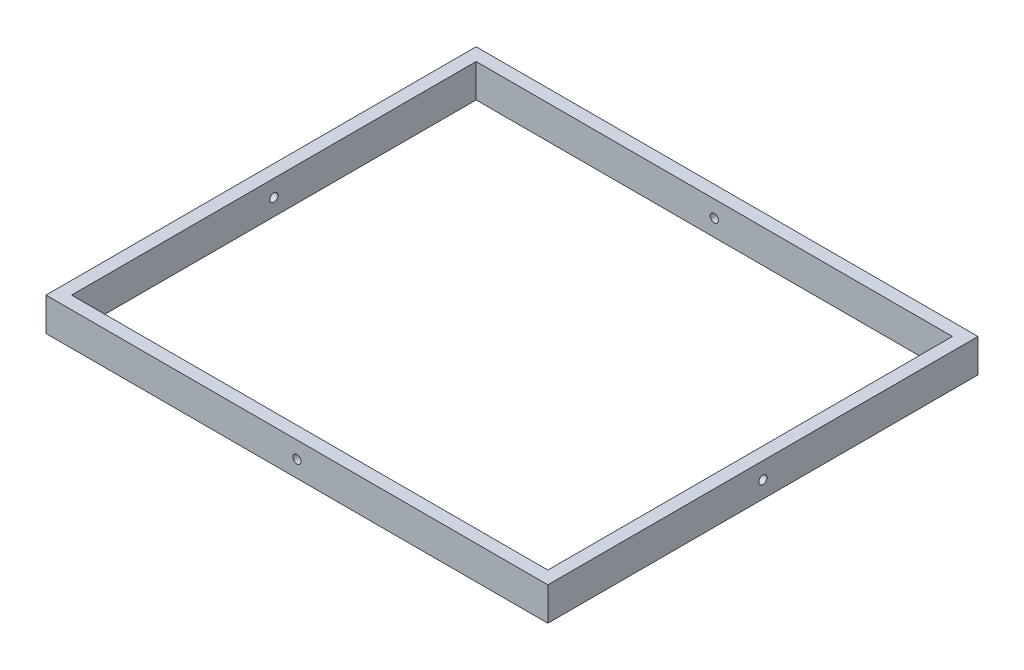
ISO-10303-21;
HEADER;
FILE_DESCRIPTION(('STEP AP214'),'2;1');
FILE_NAME('part.step','',(''),(''),'','','');
FILE_SCHEMA(('AUTOMOTIVE_DESIGN { 1 0 10303 214 1 1 1 1 }'));
ENDSEC;
DATA;
#1=APPLICATION_CONTEXT('core data for automotive mechanical design processes');
#2=APPLICATION_PROTOCOL_DEFINITION('international standard','automotive_design',2000,#1);
#3=PRODUCT_CONTEXT('',#1,'mechanical');
#4=PRODUCT('Part','Part','',(#3));
#5=PRODUCT_RELATED_PRODUCT_CATEGORY('part','',(#4));
#6=PRODUCT_DEFINITION_FORMATION('','',#4);
#7=PRODUCT_DEFINITION_CONTEXT('part definition',#1,'design');
#8=PRODUCT_DEFINITION('design','',#6,#7);
#9=PRODUCT_DEFINITION_SHAPE('','',#8);
#10=(LENGTH_UNIT() NAMED_UNIT(*) SI_UNIT(.MILLI.,.METRE.));
#11=(NAMED_UNIT(*) PLANE_ANGLE_UNIT() SI_UNIT($,.RADIAN.));
#12=(NAMED_UNIT(*) SI_UNIT($,.STERADIAN.) SOLID_ANGLE_UNIT());
#13=UNCERTAINTY_MEASURE_WITH_UNIT(LENGTH_MEASURE(1.E-05),#10,'distance_accuracy_value','');
#14=(GEOMETRIC_REPRESENTATION_CONTEXT(3) GLOBAL_UNCERTAINTY_ASSIGNED_CONTEXT((#13)) GLOBAL_UNIT_ASSIGNED_CONTEXT((#10,
#11,#12)) REPRESENTATION_CONTEXT('',''));
#15=CARTESIAN_POINT('',(0.,0.,0.));
#16=DIRECTION('',(0.,0.,1.));
#17=DIRECTION('',(1.,0.,0.));
#18=AXIS2_PLACEMENT_3D('',#15,#16,#17);
#19=CARTESIAN_POINT('',(0.,20.6375,0.));
#20=DIRECTION('',(0.,1.,0.));
#21=DIRECTION('',(0.,0.,1.));
#22=AXIS2_PLACEMENT_3D('',#19,#20,#21);
#23=PLANE('',#22);
#24=DIRECTION('',(0.,0.,1.));
#25=VECTOR('',#24,1.);
#26=CARTESIAN_POINT('',(-173.88926750961,20.6375,-63.1965982999433));
#27=LINE('',#26,#25);
#28=CARTESIAN_POINT('',(-173.88926750961,20.6375,-63.1965982999433));
#29=VERTEX_POINT('',#28);
#30=CARTESIAN_POINT('',(-173.88926750961,20.6375,203.503401700057));
#31=VERTEX_POINT('',#30);
#32=EDGE_CURVE('E157',#29,#31,#27,.T.);
#33=ORIENTED_EDGE('',*,*,#32,.T.);
#34=DIRECTION('',(1.,0.,0.));
#35=VECTOR('',#34,1.);
#36=CARTESIAN_POINT('',(-173.88926750961,20.6375,203.503401700057));
#37=LINE('',#36,#35);
#38=CARTESIAN_POINT('',(137.26073249039,20.6375,203.503401700057));
#39=VERTEX_POINT('',#38);
#40=EDGE_CURVE('E161',#31,#39,#37,.T.);
#41=ORIENTED_EDGE('',*,*,#40,.T.);
#42=DIRECTION('',(0.,0.,-1.));
#43=VECTOR('',#42,1.);
#44=CARTESIAN_POINT('',(137.26073249039,20.6375,-63.1965982999433));
#45=LINE('',#44,#43);
#46=CARTESIAN_POINT('',(137.26073249039,20.6375,-63.1965982999433));
#47=VERTEX_POINT('',#46);
#48=EDGE_CURVE('E165',#39,#47,#45,.T.);
#49=ORIENTED_EDGE('',*,*,#48,.T.);
#50=DIRECTION('',(-1.,0.,0.));
#51=VECTOR('',#50,1.);
#52=CARTESIAN_POINT('',(-173.88926750961,20.6375,-63.1965982999433));
#53=LINE('',#52,#51);
#54=EDGE_CURVE('E168',#47,#29,#53,.T.);
#55=ORIENTED_EDGE('',*,*,#54,.T.);
#56=EDGE_LOOP('',(#33,#41,#49,#55));
#57=FACE_BOUND('',#56,.T.);
#58=DIRECTION('',(1.,0.,0.));
#59=VECTOR('',#58,1.);
#60=CARTESIAN_POINT('',(-165.95176750961,20.6375,195.565901700057));
#61=LINE('',#60,#59);
#62=CARTESIAN_POINT('',(-165.95176750961,20.6375,195.565901700057));
#63=VERTEX_POINT('',#62);
#64=CARTESIAN_POINT('',(129.32323249039,20.6375,195.565901700057));
#65=VERTEX_POINT('',#64);
#66=EDGE_CURVE('E116',#63,#65,#61,.T.);
#67=ORIENTED_EDGE('',*,*,#66,.F.);
#68=DIRECTION('',(0.,0.,1.));
#69=VECTOR('',#68,1.);
#70=CARTESIAN_POINT('',(-165.95176750961,20.6375,-55.2590982999433));
#71=LINE('',#70,#69);
#72=CARTESIAN_POINT('',(-165.95176750961,20.6375,-55.2590982999433));
#73=VERTEX_POINT('',#72);
#74=EDGE_CURVE('E107',#73,#63,#71,.T.);
#75=ORIENTED_EDGE('',*,*,#74,.F.);
#76=DIRECTION('',(-1.,0.,0.));
#77=VECTOR('',#76,1.);
#78=CARTESIAN_POINT('',(-165.95176750961,20.6375,-55.2590982999433));
#79=LINE('',#78,#77);
#80=CARTESIAN_POINT('',(129.32323249039,20.6375,-55.2590982999433));
#81=VERTEX_POINT('',#80);
#82=EDGE_CURVE('E133',#81,#73,#79,.T.);
#83=ORIENTED_EDGE('',*,*,#82,.F.);
#84=DIRECTION('',(0.,0.,-1.));
#85=VECTOR('',#84,1.);
#86=CARTESIAN_POINT('',(129.32323249039,20.6375,-55.2590982999433));
#87=LINE('',#86,#85);
#88=EDGE_CURVE('E129',#65,#81,#87,.T.);
#89=ORIENTED_EDGE('',*,*,#88,.F.);
#90=EDGE_LOOP('',(#67,#75,#83,#89));
#91=FACE_BOUND('',#90,.T.);
#92=ADVANCED_FACE('F39',(#57,#91),#23,.T.);
#93=CARTESIAN_POINT('',(0.,0.,0.));
#94=DIRECTION('',(0.,1.,0.));
#95=DIRECTION('',(0.,0.,1.));
#96=AXIS2_PLACEMENT_3D('',#93,#94,#95);
#97=PLANE('',#96);
#98=DIRECTION('',(0.,0.,1.));
#99=VECTOR('',#98,1.);
#100=CARTESIAN_POINT('',(-173.88926750961,0.,-63.1965982999433));
#101=LINE('',#100,#99);
#102=CARTESIAN_POINT('',(-173.88926750961,0.,-63.1965982999433));
#103=VERTEX_POINT('',#102);
#104=CARTESIAN_POINT('',(-173.88926750961,0.,203.503401700057));
#105=VERTEX_POINT('',#104);
#106=EDGE_CURVE('E125',#103,#105,#101,.T.);
#107=ORIENTED_EDGE('',*,*,#106,.F.);
#108=DIRECTION('',(-1.,0.,0.));
#109=VECTOR('',#108,1.);
#110=CARTESIAN_POINT('',(-173.88926750961,0.,-63.1965982999433));
#111=LINE('',#110,#109);
#112=CARTESIAN_POINT('',(137.26073249039,0.,-63.1965982999433));
#113=VERTEX_POINT('',#112);
#114=EDGE_CURVE('E162',#113,#103,#111,.T.);
#115=ORIENTED_EDGE('',*,*,#114,.F.);
#116=DIRECTION('',(0.,0.,-1.));
#117=VECTOR('',#116,1.);
#118=CARTESIAN_POINT('',(137.26073249039,0.,-63.1965982999433));
#119=LINE('',#118,#117);
#120=CARTESIAN_POINT('',(137.26073249039,0.,203.503401700057));
#121=VERTEX_POINT('',#120);
#122=EDGE_CURVE('E178',#121,#113,#119,.T.);
#123=ORIENTED_EDGE('',*,*,#122,.F.);
#124=DIRECTION('',(1.,0.,0.));
#125=VECTOR('',#124,1.);
#126=CARTESIAN_POINT('',(-173.88926750961,0.,203.503401700057));
#127=LINE('',#126,#125);
#128=EDGE_CURVE('E175',#105,#121,#127,.T.);
#129=ORIENTED_EDGE('',*,*,#128,.F.);
#130=EDGE_LOOP('',(#107,#115,#123,#129));
#131=FACE_BOUND('',#130,.T.);
#132=DIRECTION('',(0.,0.,1.));
#133=VECTOR('',#132,1.);
#134=CARTESIAN_POINT('',(-165.95176750961,0.,-55.2590982999433));
#135=LINE('',#134,#133);
#136=CARTESIAN_POINT('',(-165.95176750961,0.,-55.2590982999433));
#137=VERTEX_POINT('',#136);
#138=CARTESIAN_POINT('',(-165.95176750961,0.,195.565901700057));
#139=VERTEX_POINT('',#138);
#140=EDGE_CURVE('E65',#137,#139,#135,.T.);
#141=ORIENTED_EDGE('',*,*,#140,.T.);
#142=DIRECTION('',(1.,0.,0.));
#143=VECTOR('',#142,1.);
#144=CARTESIAN_POINT('',(-165.95176750961,0.,195.565901700057));
#145=LINE('',#144,#143);
#146=CARTESIAN_POINT('',(129.32323249039,0.,195.565901700057));
#147=VERTEX_POINT('',#146);
#148=EDGE_CURVE('E123',#139,#147,#145,.T.);
#149=ORIENTED_EDGE('',*,*,#148,.T.);
#150=DIRECTION('',(0.,0.,-1.));
#151=VECTOR('',#150,1.);
#152=CARTESIAN_POINT('',(129.32323249039,0.,-55.2590982999433));
#153=LINE('',#152,#151);
#154=CARTESIAN_POINT('',(129.32323249039,0.,-55.2590982999433));
#155=VERTEX_POINT('',#154);
#156=EDGE_CURVE('E144',#147,#155,#153,.T.);
#157=ORIENTED_EDGE('',*,*,#156,.T.);
#158=DIRECTION('',(-1.,0.,0.));
#159=VECTOR('',#158,1.);
#160=CARTESIAN_POINT('',(-165.95176750961,0.,-55.2590982999433));
#161=LINE('',#160,#159);
#162=EDGE_CURVE('E117',#155,#137,#161,.T.);
#163=ORIENTED_EDGE('',*,*,#162,.T.);
#164=EDGE_LOOP('',(#141,#149,#157,#163));
#165=FACE_BOUND('',#164,.T.);
#166=ADVANCED_FACE('F237',(#131,#165),#97,.F.);
#167=CARTESIAN_POINT('',(-173.88926750961,20.6375,-63.1965982999433));
#168=DIRECTION('',(1.,0.,0.));
#169=DIRECTION('',(0.,0.,-1.));
#170=AXIS2_PLACEMENT_3D('',#167,#168,#169);
#171=PLANE('',#170);
#172=CARTESIAN_POINT('',(-173.88926750961,10.31875,70.1534017000567));
#173=DIRECTION('',(1.,0.,0.));
#174=DIRECTION('',(0.,0.,-1.));
#175=AXIS2_PLACEMENT_3D('',#172,#173,#174);
#176=CIRCLE('',#175,2.54);
#177=CARTESIAN_POINT('',(-173.88926750961,10.31875,67.6134017000568));
#178=VERTEX_POINT('',#177);
#179=EDGE_CURVE('E218',#178,#178,#176,.T.);
#180=ORIENTED_EDGE('',*,*,#179,.T.);
#181=EDGE_LOOP('',(#180));
#182=FACE_BOUND('',#181,.T.);
#183=ORIENTED_EDGE('',*,*,#106,.T.);
#184=DIRECTION('',(0.,-1.,0.));
#185=VECTOR('',#184,1.);
#186=CARTESIAN_POINT('',(-173.88926750961,20.6375,203.503401700057));
#187=LINE('',#186,#185);
#188=EDGE_CURVE('E11',#31,#105,#187,.T.);
#189=ORIENTED_EDGE('',*,*,#188,.F.);
#190=ORIENTED_EDGE('',*,*,#32,.F.);
#191=DIRECTION('',(0.,-1.,0.));
#192=VECTOR('',#191,1.);
#193=CARTESIAN_POINT('',(-173.88926750961,20.6375,-63.1965982999433));
#194=LINE('',#193,#192);
#195=EDGE_CURVE('E171',#29,#103,#194,.T.);
#196=ORIENTED_EDGE('',*,*,#195,.T.);
#197=EDGE_LOOP('',(#183,#189,#190,#196));
#198=FACE_BOUND('',#197,.T.);
#199=ADVANCED_FACE('F41',(#182,#198),#171,.F.);
#200=CARTESIAN_POINT('',(-173.88926750961,20.6375,203.503401700057));
#201=DIRECTION('',(0.,0.,-1.));
#202=DIRECTION('',(-1.,0.,0.));
#203=AXIS2_PLACEMENT_3D('',#200,#201,#202);
#204=PLANE('',#203);
#205=CARTESIAN_POINT('',(-18.3142675096096,10.31875,203.503401700057));
#206=DIRECTION('',(0.,0.,1.));
#207=DIRECTION('',(1.,0.,0.));
#208=AXIS2_PLACEMENT_3D('',#205,#206,#207);
#209=CIRCLE('',#208,2.54);
#210=CARTESIAN_POINT('',(-15.7742675096096,10.31875,203.503401700057));
#211=VERTEX_POINT('',#210);
#212=EDGE_CURVE('E202',#211,#211,#209,.T.);
#213=ORIENTED_EDGE('',*,*,#212,.F.);
#214=EDGE_LOOP('',(#213));
#215=FACE_BOUND('',#214,.T.);
#216=ORIENTED_EDGE('',*,*,#128,.T.);
#217=DIRECTION('',(0.,-1.,0.));
#218=VECTOR('',#217,1.);
#219=CARTESIAN_POINT('',(137.26073249039,20.6375,203.503401700057));
#220=LINE('',#219,#218);
#221=EDGE_CURVE('E49',#39,#121,#220,.T.);
#222=ORIENTED_EDGE('',*,*,#221,.F.);
#223=ORIENTED_EDGE('',*,*,#40,.F.);
#224=ORIENTED_EDGE('',*,*,#188,.T.);
#225=EDGE_LOOP('',(#216,#222,#223,#224));
#226=FACE_BOUND('',#225,.T.);
#227=ADVANCED_FACE('F263',(#215,#226),#204,.F.);
#228=CARTESIAN_POINT('',(137.26073249039,20.6375,-63.1965982999433));
#229=DIRECTION('',(-1.,0.,0.));
#230=DIRECTION('',(0.,0.,1.));
#231=AXIS2_PLACEMENT_3D('',#228,#229,#230);
#232=PLANE('',#231);
#233=CARTESIAN_POINT('',(137.26073249039,10.31875,70.1534017000567));
#234=DIRECTION('',(1.,0.,0.));
#235=DIRECTION('',(0.,0.,-1.));
#236=AXIS2_PLACEMENT_3D('',#233,#234,#235);
#237=CIRCLE('',#236,2.54);
#238=CARTESIAN_POINT('',(137.26073249039,10.31875,67.6134017000567));
#239=VERTEX_POINT('',#238);
#240=EDGE_CURVE('E214',#239,#239,#237,.T.);
#241=ORIENTED_EDGE('',*,*,#240,.F.);
#242=EDGE_LOOP('',(#241));
#243=FACE_BOUND('',#242,.T.);
#244=ORIENTED_EDGE('',*,*,#122,.T.);
#245=DIRECTION('',(0.,-1.,0.));
#246=VECTOR('',#245,1.);
#247=CARTESIAN_POINT('',(137.26073249039,20.6375,-63.1965982999433));
#248=LINE('',#247,#246);
#249=EDGE_CURVE('E186',#47,#113,#248,.T.);
#250=ORIENTED_EDGE('',*,*,#249,.F.);
#251=ORIENTED_EDGE('',*,*,#48,.F.);
#252=ORIENTED_EDGE('',*,*,#221,.T.);
#253=EDGE_LOOP('',(#244,#250,#251,#252));
#254=FACE_BOUND('',#253,.T.);
#255=ADVANCED_FACE('F261',(#243,#254),#232,.F.);
#256=CARTESIAN_POINT('',(-173.88926750961,20.6375,-63.1965982999433));
#257=DIRECTION('',(0.,0.,1.));
#258=DIRECTION('',(1.,0.,0.));
#259=AXIS2_PLACEMENT_3D('',#256,#257,#258);
#260=PLANE('',#259);
#261=CARTESIAN_POINT('',(-18.3142675096096,10.31875,-63.1965982999433));
#262=DIRECTION('',(0.,0.,1.));
#263=DIRECTION('',(1.,0.,0.));
#264=AXIS2_PLACEMENT_3D('',#261,#262,#263);
#265=CIRCLE('',#264,2.54);
#266=CARTESIAN_POINT('',(-15.7742675096096,10.31875,-63.1965982999433));
#267=VERTEX_POINT('',#266);
#268=EDGE_CURVE('E195',#267,#267,#265,.T.);
#269=ORIENTED_EDGE('',*,*,#268,.T.);
#270=EDGE_LOOP('',(#269));
#271=FACE_BOUND('',#270,.T.);
#272=ORIENTED_EDGE('',*,*,#114,.T.);
#273=ORIENTED_EDGE('',*,*,#195,.F.);
#274=ORIENTED_EDGE('',*,*,#54,.F.);
#275=ORIENTED_EDGE('',*,*,#249,.T.);
#276=EDGE_LOOP('',(#272,#273,#274,#275));
#277=FACE_BOUND('',#276,.T.);
#278=ADVANCED_FACE('F258',(#271,#277),#260,.F.);
#279=CARTESIAN_POINT('',(-165.95176750961,20.6375,-55.2590982999433));
#280=DIRECTION('',(1.,0.,0.));
#281=DIRECTION('',(0.,0.,-1.));
#282=AXIS2_PLACEMENT_3D('',#279,#280,#281);
#283=PLANE('',#282);
#284=CARTESIAN_POINT('',(-165.95176750961,10.31875,70.1534017000567));
#285=DIRECTION('',(1.,0.,0.));
#286=DIRECTION('',(0.,0.,-1.));
#287=AXIS2_PLACEMENT_3D('',#284,#285,#286);
#288=CIRCLE('',#287,2.54);
#289=CARTESIAN_POINT('',(-165.95176750961,10.31875,67.6134017000568));
#290=VERTEX_POINT('',#289);
#291=EDGE_CURVE('E208',#290,#290,#288,.T.);
#292=ORIENTED_EDGE('',*,*,#291,.F.);
#293=EDGE_LOOP('',(#292));
#294=FACE_BOUND('',#293,.T.);
#295=ORIENTED_EDGE('',*,*,#140,.F.);
#296=DIRECTION('',(0.,-1.,0.));
#297=VECTOR('',#296,1.);
#298=CARTESIAN_POINT('',(-165.95176750961,20.6375,-55.2590982999433));
#299=LINE('',#298,#297);
#300=EDGE_CURVE('E111',#73,#137,#299,.T.);
#301=ORIENTED_EDGE('',*,*,#300,.F.);
#302=ORIENTED_EDGE('',*,*,#74,.T.);
#303=DIRECTION('',(0.,-1.,0.));
#304=VECTOR('',#303,1.);
#305=CARTESIAN_POINT('',(-165.95176750961,20.6375,195.565901700057));
#306=LINE('',#305,#304);
#307=EDGE_CURVE('E110',#63,#139,#306,.T.);
#308=ORIENTED_EDGE('',*,*,#307,.T.);
#309=EDGE_LOOP('',(#295,#301,#302,#308));
#310=FACE_BOUND('',#309,.T.);
#311=ADVANCED_FACE('F109',(#294,#310),#283,.T.);
#312=CARTESIAN_POINT('',(-165.95176750961,20.6375,195.565901700057));
#313=DIRECTION('',(0.,0.,-1.));
#314=DIRECTION('',(-1.,0.,0.));
#315=AXIS2_PLACEMENT_3D('',#312,#313,#314);
#316=PLANE('',#315);
#317=CARTESIAN_POINT('',(-18.3142675096096,10.31875,195.565901700057));
#318=DIRECTION('',(0.,0.,-1.));
#319=DIRECTION('',(-1.,0.,0.));
#320=AXIS2_PLACEMENT_3D('',#317,#318,#319);
#321=CIRCLE('',#320,2.54);
#322=CARTESIAN_POINT('',(-20.8542675096096,10.31875,195.565901700057));
#323=VERTEX_POINT('',#322);
#324=EDGE_CURVE('E141',#323,#323,#321,.T.);
#325=ORIENTED_EDGE('',*,*,#324,.F.);
#326=EDGE_LOOP('',(#325));
#327=FACE_BOUND('',#326,.T.);
#328=ORIENTED_EDGE('',*,*,#148,.F.);
#329=ORIENTED_EDGE('',*,*,#307,.F.);
#330=ORIENTED_EDGE('',*,*,#66,.T.);
#331=DIRECTION('',(0.,-1.,0.));
#332=VECTOR('',#331,1.);
#333=CARTESIAN_POINT('',(129.32323249039,20.6375,195.565901700057));
#334=LINE('',#333,#332);
#335=EDGE_CURVE('E126',#65,#147,#334,.T.);
#336=ORIENTED_EDGE('',*,*,#335,.T.);
#337=EDGE_LOOP('',(#328,#329,#330,#336));
#338=FACE_BOUND('',#337,.T.);
#339=ADVANCED_FACE('F120',(#327,#338),#316,.T.);
#340=CARTESIAN_POINT('',(129.32323249039,20.6375,-55.2590982999433));
#341=DIRECTION('',(-1.,0.,0.));
#342=DIRECTION('',(0.,0.,1.));
#343=AXIS2_PLACEMENT_3D('',#340,#341,#342);
#344=PLANE('',#343);
#345=CARTESIAN_POINT('',(129.32323249039,10.31875,70.1534017000567));
#346=DIRECTION('',(-1.,0.,0.));
#347=DIRECTION('',(0.,0.,1.));
#348=AXIS2_PLACEMENT_3D('',#345,#346,#347);
#349=CIRCLE('',#348,2.54);
#350=CARTESIAN_POINT('',(129.32323249039,10.31875,72.6934017000567));
#351=VERTEX_POINT('',#350);
#352=EDGE_CURVE('E43',#351,#351,#349,.T.);
#353=ORIENTED_EDGE('',*,*,#352,.F.);
#354=EDGE_LOOP('',(#353));
#355=FACE_BOUND('',#354,.T.);
#356=ORIENTED_EDGE('',*,*,#156,.F.);
#357=ORIENTED_EDGE('',*,*,#335,.F.);
#358=ORIENTED_EDGE('',*,*,#88,.T.);
#359=DIRECTION('',(0.,-1.,0.));
#360=VECTOR('',#359,1.);
#361=CARTESIAN_POINT('',(129.32323249039,20.6375,-55.2590982999433));
#362=LINE('',#361,#360);
#363=EDGE_CURVE('E57',#81,#155,#362,.T.);
#364=ORIENTED_EDGE('',*,*,#363,.T.);
#365=EDGE_LOOP('',(#356,#357,#358,#364));
#366=FACE_BOUND('',#365,.T.);
#367=ADVANCED_FACE('F230',(#355,#366),#344,.T.);
#368=CARTESIAN_POINT('',(-165.95176750961,20.6375,-55.2590982999433));
#369=DIRECTION('',(0.,0.,1.));
#370=DIRECTION('',(1.,0.,0.));
#371=AXIS2_PLACEMENT_3D('',#368,#369,#370);
#372=PLANE('',#371);
#373=CARTESIAN_POINT('',(-18.3142675096096,10.31875,-55.2590982999433));
#374=DIRECTION('',(0.,0.,1.));
#375=DIRECTION('',(1.,0.,0.));
#376=AXIS2_PLACEMENT_3D('',#373,#374,#375);
#377=CIRCLE('',#376,2.54);
#378=CARTESIAN_POINT('',(-15.7742675096096,10.31875,-55.2590982999433));
#379=VERTEX_POINT('',#378);
#380=EDGE_CURVE('E192',#379,#379,#377,.T.);
#381=ORIENTED_EDGE('',*,*,#380,.F.);
#382=EDGE_LOOP('',(#381));
#383=FACE_BOUND('',#382,.T.);
#384=ORIENTED_EDGE('',*,*,#162,.F.);
#385=ORIENTED_EDGE('',*,*,#363,.F.);
#386=ORIENTED_EDGE('',*,*,#82,.T.);
#387=ORIENTED_EDGE('',*,*,#300,.T.);
#388=EDGE_LOOP('',(#384,#385,#386,#387));
#389=FACE_BOUND('',#388,.T.);
#390=ADVANCED_FACE('F233',(#383,#389),#372,.T.);
#391=CARTESIAN_POINT('',(-18.3142675096096,10.31875,-63.1965982999433));
#392=DIRECTION('',(0.,0.,1.));
#393=DIRECTION('',(1.,0.,0.));
#394=AXIS2_PLACEMENT_3D('',#391,#392,#393);
#395=CYLINDRICAL_SURFACE('',#394,2.54);
#396=ORIENTED_EDGE('',*,*,#380,.T.);
#397=EDGE_LOOP('',(#396));
#398=FACE_BOUND('',#397,.T.);
#399=ORIENTED_EDGE('',*,*,#268,.F.);
#400=EDGE_LOOP('',(#399));
#401=FACE_BOUND('',#400,.T.);
#402=ADVANCED_FACE('F239',(#398,#401),#395,.F.);
#403=ORIENTED_EDGE('',*,*,#324,.T.);
#404=EDGE_LOOP('',(#403));
#405=FACE_BOUND('',#404,.T.);
#406=ORIENTED_EDGE('',*,*,#212,.T.);
#407=EDGE_LOOP('',(#406));
#408=FACE_BOUND('',#407,.T.);
#409=ADVANCED_FACE('F245',(#405,#408),#395,.F.);
#410=CARTESIAN_POINT('',(-173.88926750961,10.31875,70.1534017000567));
#411=DIRECTION('',(1.,0.,0.));
#412=DIRECTION('',(0.,0.,-1.));
#413=AXIS2_PLACEMENT_3D('',#410,#411,#412);
#414=CYLINDRICAL_SURFACE('',#413,2.54);
#415=ORIENTED_EDGE('',*,*,#352,.T.);
#416=EDGE_LOOP('',(#415));
#417=FACE_BOUND('',#416,.T.);
#418=ORIENTED_EDGE('',*,*,#240,.T.);
#419=EDGE_LOOP('',(#418));
#420=FACE_BOUND('',#419,.T.);
#421=ADVANCED_FACE('F227',(#417,#420),#414,.F.);
#422=ORIENTED_EDGE('',*,*,#291,.T.);
#423=EDGE_LOOP('',(#422));
#424=FACE_BOUND('',#423,.T.);
#425=ORIENTED_EDGE('',*,*,#179,.F.);
#426=EDGE_LOOP('',(#425));
#427=FACE_BOUND('',#426,.T.);
#428=ADVANCED_FACE('F291',(#424,#427),#414,.F.);
#429=CLOSED_SHELL('',(#92,#166,#199,#227,#255,#278,#311,#339,#367,#390,#402,#409,#421,#428));
#430=MANIFOLD_SOLID_BREP('B2',#429);
#431=ADVANCED_BREP_SHAPE_REPRESENTATION('',(#18,#430),#14);
#432=SHAPE_DEFINITION_REPRESENTATION(#9,#431);
ENDSEC;
END-ISO-10303-21;
